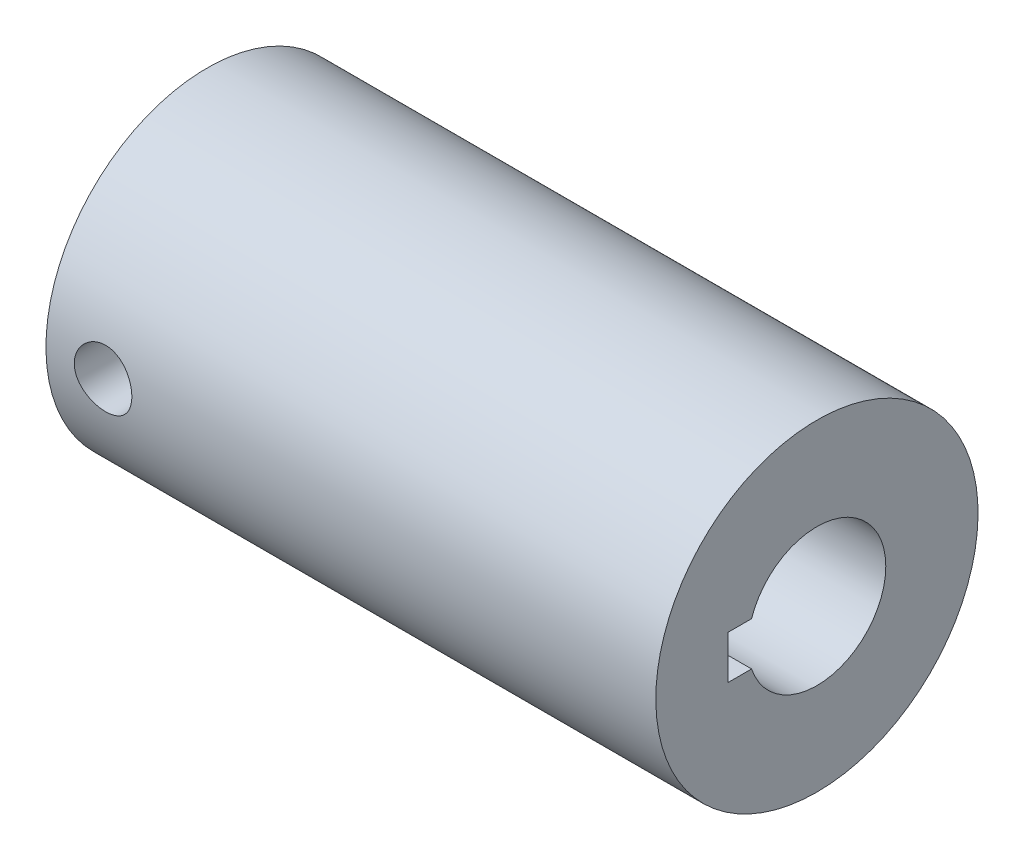
ISO-10303-21;
HEADER;
FILE_DESCRIPTION(('STEP AP214'),'2;1');
FILE_NAME('part.step','',(''),(''),'','','');
FILE_SCHEMA(('AUTOMOTIVE_DESIGN { 1 0 10303 214 1 1 1 1 }'));
ENDSEC;
DATA;
#1=APPLICATION_CONTEXT('core data for automotive mechanical design processes');
#2=APPLICATION_PROTOCOL_DEFINITION('international standard','automotive_design',2000,#1);
#3=PRODUCT_CONTEXT('',#1,'mechanical');
#4=PRODUCT('Part','Part','',(#3));
#5=PRODUCT_RELATED_PRODUCT_CATEGORY('part','',(#4));
#6=PRODUCT_DEFINITION_FORMATION('','',#4);
#7=PRODUCT_DEFINITION_CONTEXT('part definition',#1,'design');
#8=PRODUCT_DEFINITION('design','',#6,#7);
#9=PRODUCT_DEFINITION_SHAPE('','',#8);
#10=(LENGTH_UNIT() NAMED_UNIT(*) SI_UNIT(.MILLI.,.METRE.));
#11=(NAMED_UNIT(*) PLANE_ANGLE_UNIT() SI_UNIT($,.RADIAN.));
#12=(NAMED_UNIT(*) SI_UNIT($,.STERADIAN.) SOLID_ANGLE_UNIT());
#13=UNCERTAINTY_MEASURE_WITH_UNIT(LENGTH_MEASURE(1.E-05),#10,'distance_accuracy_value','');
#14=(GEOMETRIC_REPRESENTATION_CONTEXT(3) GLOBAL_UNCERTAINTY_ASSIGNED_CONTEXT((#13)) GLOBAL_UNIT_ASSIGNED_CONTEXT((#10,
#11,#12)) REPRESENTATION_CONTEXT('',''));
#15=CARTESIAN_POINT('',(0.,0.,0.));
#16=DIRECTION('',(0.,0.,1.));
#17=DIRECTION('',(1.,0.,0.));
#18=AXIS2_PLACEMENT_3D('',#15,#16,#17);
#19=CARTESIAN_POINT('',(30.1508,-2.99974000000001,0.));
#20=DIRECTION('',(0.,-1.,0.));
#21=DIRECTION('',(0.,0.,-1.));
#22=AXIS2_PLACEMENT_3D('',#19,#20,#21);
#23=PLANE('',#22);
#24=DIRECTION('',(0.,0.,1.));
#25=VECTOR('',#24,1.);
#26=CARTESIAN_POINT('',(-89.789,-2.99973999999995,0.));
#27=LINE('',#26,#25);
#28=CARTESIAN_POINT('',(-89.789,-2.99973999999995,9.01396471772544));
#29=VERTEX_POINT('',#28);
#30=CARTESIAN_POINT('',(-89.789,-2.99973999999995,12.2936));
#31=VERTEX_POINT('',#30);
#32=EDGE_CURVE('E89',#29,#31,#27,.T.);
#33=ORIENTED_EDGE('',*,*,#32,.T.);
#34=DIRECTION('',(1.,0.,0.));
#35=VECTOR('',#34,1.);
#36=CARTESIAN_POINT('',(30.1508,-2.99973999999994,12.2936));
#37=LINE('',#36,#35);
#38=CARTESIAN_POINT('',(-84.5135643141744,-2.99973999999993,12.2936));
#39=VERTEX_POINT('',#38);
#40=EDGE_CURVE('E84',#31,#39,#37,.T.);
#41=ORIENTED_EDGE('',*,*,#40,.T.);
#42=DIRECTION('',(0.,0.,-1.));
#43=VECTOR('',#42,1.);
#44=CARTESIAN_POINT('',(-84.5135643141744,-2.99973999999996,22.225));
#45=LINE('',#44,#43);
#46=CARTESIAN_POINT('',(-84.5135643141744,-2.99973999999992,9.01396471772545));
#47=VERTEX_POINT('',#46);
#48=EDGE_CURVE('E86',#39,#47,#45,.T.);
#49=ORIENTED_EDGE('',*,*,#48,.T.);
#50=DIRECTION('',(-1.,0.,0.));
#51=VECTOR('',#50,1.);
#52=CARTESIAN_POINT('',(-89.789,-2.99973999999996,9.01396471772544));
#53=LINE('',#52,#51);
#54=EDGE_CURVE('E208',#47,#29,#53,.T.);
#55=ORIENTED_EDGE('',*,*,#54,.T.);
#56=EDGE_LOOP('',(#33,#41,#49,#55));
#57=FACE_BOUND('',#56,.T.);
#58=ADVANCED_FACE('F17',(#57),#23,.F.);
#59=CARTESIAN_POINT('',(30.1508,-2.99973999999996,12.2936));
#60=DIRECTION('',(0.,0.,1.));
#61=DIRECTION('',(0.,-1.,0.));
#62=AXIS2_PLACEMENT_3D('',#59,#60,#61);
#63=PLANE('',#62);
#64=CARTESIAN_POINT('',(-81.915,0.,12.2936));
#65=DIRECTION('',(0.,0.,-1.));
#66=DIRECTION('',(0.,1.,0.));
#67=AXIS2_PLACEMENT_3D('',#64,#65,#66);
#68=CIRCLE('',#67,3.96875);
#69=CARTESIAN_POINT('',(-84.5135643141742,2.99974000000004,12.2936));
#70=VERTEX_POINT('',#69);
#71=EDGE_CURVE('E20',#70,#39,#68,.F.);
#72=ORIENTED_EDGE('',*,*,#71,.T.);
#73=ORIENTED_EDGE('',*,*,#40,.F.);
#74=DIRECTION('',(0.,1.,0.));
#75=VECTOR('',#74,1.);
#76=CARTESIAN_POINT('',(-89.789,0.,12.2936));
#77=LINE('',#76,#75);
#78=CARTESIAN_POINT('',(-89.789,2.99974000000005,12.2936));
#79=VERTEX_POINT('',#78);
#80=EDGE_CURVE('E122',#31,#79,#77,.T.);
#81=ORIENTED_EDGE('',*,*,#80,.T.);
#82=DIRECTION('',(1.,0.,0.));
#83=VECTOR('',#82,1.);
#84=CARTESIAN_POINT('',(30.1508,2.99974000000003,12.2936));
#85=LINE('',#84,#83);
#86=EDGE_CURVE('E78',#79,#70,#85,.T.);
#87=ORIENTED_EDGE('',*,*,#86,.T.);
#88=EDGE_LOOP('',(#72,#73,#81,#87));
#89=FACE_BOUND('',#88,.T.);
#90=ADVANCED_FACE('F94',(#89),#63,.F.);
#91=CARTESIAN_POINT('',(30.1508,2.99973999999998,0.));
#92=DIRECTION('',(0.,1.,0.));
#93=DIRECTION('',(0.,0.,1.));
#94=AXIS2_PLACEMENT_3D('',#91,#92,#93);
#95=PLANE('',#94);
#96=DIRECTION('',(0.,0.,-1.));
#97=VECTOR('',#96,1.);
#98=CARTESIAN_POINT('',(-84.5135643141742,2.99973999999998,22.225));
#99=LINE('',#98,#97);
#100=CARTESIAN_POINT('',(-84.5135643141742,2.99974000000004,9.01396471772541));
#101=VERTEX_POINT('',#100);
#102=EDGE_CURVE('E98',#101,#70,#99,.F.);
#103=ORIENTED_EDGE('',*,*,#102,.T.);
#104=ORIENTED_EDGE('',*,*,#86,.F.);
#105=DIRECTION('',(0.,0.,1.));
#106=VECTOR('',#105,1.);
#107=CARTESIAN_POINT('',(-89.789,2.99974000000005,0.));
#108=LINE('',#107,#106);
#109=CARTESIAN_POINT('',(-89.789,2.99974000000004,9.0139647177254));
#110=VERTEX_POINT('',#109);
#111=EDGE_CURVE('E125',#79,#110,#108,.F.);
#112=ORIENTED_EDGE('',*,*,#111,.T.);
#113=DIRECTION('',(-1.,0.,0.));
#114=VECTOR('',#113,1.);
#115=CARTESIAN_POINT('',(-89.789,2.99974000000004,9.0139647177254));
#116=LINE('',#115,#114);
#117=EDGE_CURVE('E132',#110,#101,#116,.F.);
#118=ORIENTED_EDGE('',*,*,#117,.T.);
#119=EDGE_LOOP('',(#103,#104,#112,#118));
#120=FACE_BOUND('',#119,.T.);
#121=ADVANCED_FACE('F176',(#120),#95,.F.);
#122=CARTESIAN_POINT('',(-81.915,0.,22.225));
#123=DIRECTION('',(0.,0.,-1.));
#124=DIRECTION('',(0.,1.,0.));
#125=AXIS2_PLACEMENT_3D('',#122,#123,#124);
#126=CYLINDRICAL_SURFACE('',#125,3.96875);
#127=CARTESIAN_POINT('',(-81.915,-3.96875000000008,21.867776485905));
#128=CARTESIAN_POINT('',(-82.025442636118,-3.96874939226582,21.8677767602575));
#129=CARTESIAN_POINT('',(-82.1359004163819,-3.96413569219448,21.8686154974175));
#130=CARTESIAN_POINT('',(-82.3560623582988,-3.94571332924585,21.8719467812869));
#131=CARTESIAN_POINT('',(-82.4657661490558,-3.9319004284361,21.8744400902305));
#132=CARTESIAN_POINT('',(-82.683775385004,-3.89514987144164,21.8810142396303));
#133=CARTESIAN_POINT('',(-82.7920783271779,-3.87219772983373,21.8850976000425));
#134=CARTESIAN_POINT('',(-83.0063423595681,-3.81735533042714,21.8947296463722));
#135=CARTESIAN_POINT('',(-83.1123025429119,-3.78546167456492,21.9002788893259));
#136=CARTESIAN_POINT('',(-83.4251730717987,-3.67680964916369,21.9188771458524));
#137=CARTESIAN_POINT('',(-83.6276048107322,-3.58698992518624,21.9338938717271));
#138=CARTESIAN_POINT('',(-84.0143457567725,-3.37526108072031,21.9674678496212));
#139=CARTESIAN_POINT('',(-84.1986613814016,-3.25336338033938,21.9860238409779));
#140=CARTESIAN_POINT('',(-84.5462627620137,-2.97940737605812,22.024827885717));
#141=CARTESIAN_POINT('',(-84.7093141951588,-2.82705339979221,22.0450913015638));
#142=CARTESIAN_POINT('',(-85.0076843051578,-2.49715122728141,22.0848910813289));
#143=CARTESIAN_POINT('',(-85.1429997936484,-2.31960013848836,22.1044273614489));
#144=CARTESIAN_POINT('',(-85.3829360222393,-1.94283484404581,22.140732248718));
#145=CARTESIAN_POINT('',(-85.4873397070742,-1.74348031319472,22.1574809389394));
#146=CARTESIAN_POINT('',(-85.6610876135916,-1.32971473489753,22.1861541422642));
#147=CARTESIAN_POINT('',(-85.7304347510135,-1.1153049413247,22.1980790565565));
#148=CARTESIAN_POINT('',(-85.8313885938242,-0.679916397485183,22.2156540237676));
#149=CARTESIAN_POINT('',(-85.8633861600919,-0.459030941855096,22.2213690185752));
#150=CARTESIAN_POINT('',(-85.8899490806145,-0.0149573644597973,22.2261037452233));
#151=CARTESIAN_POINT('',(-85.8845172772119,0.208230581171812,22.2251239854558));
#152=CARTESIAN_POINT('',(-85.836677977728,0.647894355631717,22.2166306580354));
#153=CARTESIAN_POINT('',(-85.7946915582586,0.864417646451671,22.2091914995076));
#154=CARTESIAN_POINT('',(-85.67559825955,1.28729742536011,22.1886983406287));
#155=CARTESIAN_POINT('',(-85.5984899110834,1.49365348773088,22.1756441053879));
#156=CARTESIAN_POINT('',(-85.4109324393134,1.8915794953395,22.1452617876054));
#157=CARTESIAN_POINT('',(-85.3003116588414,2.08306678025422,22.1279117869715));
#158=CARTESIAN_POINT('',(-85.0489950388308,2.44490698640731,22.0908619816255));
#159=CARTESIAN_POINT('',(-84.9082986963396,2.61525955413537,22.0711621376195));
#160=CARTESIAN_POINT('',(-84.5985607802396,2.93245913235298,22.0312791039267));
#161=CARTESIAN_POINT('',(-84.4291564141264,3.0789511418215,22.011092991898));
#162=CARTESIAN_POINT('',(-84.0677962242434,3.34159862141902,21.9727567806048));
#163=CARTESIAN_POINT('',(-83.8758303561112,3.45774050495988,21.9546075952613));
#164=CARTESIAN_POINT('',(-83.5750602440458,3.60663227272165,21.9304660897003));
#165=CARTESIAN_POINT('',(-83.4724860575241,3.6520968835151,21.9229227079668));
#166=CARTESIAN_POINT('',(-83.2637962407809,3.7342032369678,21.9090869485222));
#167=CARTESIAN_POINT('',(-83.1576820027668,3.77084840257221,21.9027940856336));
#168=CARTESIAN_POINT('',(-82.9428503304319,3.8349776001294,21.8916565995994));
#169=CARTESIAN_POINT('',(-82.834137561204,3.86247689561886,21.8868095649205));
#170=CARTESIAN_POINT('',(-82.6147600053551,3.90817796268864,21.8786953798662));
#171=CARTESIAN_POINT('',(-82.5040961821683,3.92638419713976,21.8754274711765));
#172=CARTESIAN_POINT('',(-82.313609781564,3.94948899290812,21.8712654442787));
#173=CARTESIAN_POINT('',(-82.2340696890173,3.95670884901232,21.8699589399116));
#174=CARTESIAN_POINT('',(-82.0746890365532,3.96633957521733,21.8682143610124));
#175=CARTESIAN_POINT('',(-81.9948484762651,3.96875043938326,21.867776287552));
#176=CARTESIAN_POINT('',(-81.804557363882,3.96874939226566,21.8677767602575));
#177=CARTESIAN_POINT('',(-81.6940995836181,3.96413569219431,21.8686154974175));
#178=CARTESIAN_POINT('',(-81.4739376417012,3.94571332924569,21.8719467812869));
#179=CARTESIAN_POINT('',(-81.3642338509442,3.93190042843594,21.8744400902305));
#180=CARTESIAN_POINT('',(-81.146224614996,3.89514987144147,21.8810142396303));
#181=CARTESIAN_POINT('',(-81.0379216728221,3.87219772983357,21.8850976000426));
#182=CARTESIAN_POINT('',(-80.8236576404319,3.81735533042697,21.8947296463723));
#183=CARTESIAN_POINT('',(-80.7176974570881,3.78546167456476,21.9002788893259));
#184=CARTESIAN_POINT('',(-80.4048269282013,3.67680964916353,21.9188771458524));
#185=CARTESIAN_POINT('',(-80.2023951892678,3.58698992518608,21.9338938717271));
#186=CARTESIAN_POINT('',(-79.8156542432275,3.37526108072015,21.9674678496212));
#187=CARTESIAN_POINT('',(-79.6313386185984,3.25336338033922,21.9860238409779));
#188=CARTESIAN_POINT('',(-79.2837372379863,2.97940737605796,22.0248278857171));
#189=CARTESIAN_POINT('',(-79.1206858048412,2.82705339979205,22.0450913015638));
#190=CARTESIAN_POINT('',(-78.8223156948422,2.49715122728125,22.0848910813289));
#191=CARTESIAN_POINT('',(-78.6870002063517,2.31960013848819,22.1044273614489));
#192=CARTESIAN_POINT('',(-78.4470639777607,1.94283484404565,22.1407322487181));
#193=CARTESIAN_POINT('',(-78.3426602929258,1.74348031319456,22.1574809389394));
#194=CARTESIAN_POINT('',(-78.1689123864084,1.32971473489736,22.1861541422642));
#195=CARTESIAN_POINT('',(-78.0995652489865,1.11530494132453,22.1980790565565));
#196=CARTESIAN_POINT('',(-77.9986114061758,0.679916397485019,22.2156540237676));
#197=CARTESIAN_POINT('',(-77.966613839908,0.459030941854932,22.2213690185752));
#198=CARTESIAN_POINT('',(-77.9400509193855,0.0149573644596333,22.2261037452233));
#199=CARTESIAN_POINT('',(-77.9454827227881,-0.208230581171976,22.2251239854558));
#200=CARTESIAN_POINT('',(-77.993322022272,-0.647894355631881,22.2166306580354));
#201=CARTESIAN_POINT('',(-78.0353084417414,-0.864417646451835,22.2091914995076));
#202=CARTESIAN_POINT('',(-78.15440174045,-1.28729742536028,22.1886983406287));
#203=CARTESIAN_POINT('',(-78.2315100889166,-1.49365348773105,22.1756441053879));
#204=CARTESIAN_POINT('',(-78.4190675606866,-1.89157949533966,22.1452617876054));
#205=CARTESIAN_POINT('',(-78.5296883411586,-2.08306678025438,22.1279117869714));
#206=CARTESIAN_POINT('',(-78.7810049611692,-2.44490698640748,22.0908619816255));
#207=CARTESIAN_POINT('',(-78.9217013036604,-2.61525955413553,22.0711621376195));
#208=CARTESIAN_POINT('',(-79.2314392197604,-2.93245913235314,22.0312791039267));
#209=CARTESIAN_POINT('',(-79.4008435858736,-3.07895114182165,22.011092991898));
#210=CARTESIAN_POINT('',(-79.7622037757566,-3.34159862141917,21.9727567806048));
#211=CARTESIAN_POINT('',(-79.9541696438888,-3.45774050496003,21.9546075952613));
#212=CARTESIAN_POINT('',(-80.2549397559542,-3.60663227272181,21.9304660897002));
#213=CARTESIAN_POINT('',(-80.3575139424759,-3.65209688351526,21.9229227079668));
#214=CARTESIAN_POINT('',(-80.5662037592191,-3.73420323696796,21.9090869485221));
#215=CARTESIAN_POINT('',(-80.6723179972332,-3.77084840257237,21.9027940856336));
#216=CARTESIAN_POINT('',(-80.8871496695681,-3.83497760012956,21.8916565995994));
#217=CARTESIAN_POINT('',(-80.995862438796,-3.86247689561902,21.8868095649205));
#218=CARTESIAN_POINT('',(-81.2152399946449,-3.9081779626888,21.8786953798662));
#219=CARTESIAN_POINT('',(-81.3259038178317,-3.92638419713992,21.8754274711765));
#220=CARTESIAN_POINT('',(-81.516390218436,-3.94948899290828,21.8712654442787));
#221=CARTESIAN_POINT('',(-81.5959303109827,-3.95670884901248,21.8699589399115));
#222=CARTESIAN_POINT('',(-81.7553109634468,-3.96633957521749,21.8682143610123));
#223=CARTESIAN_POINT('',(-81.8351515237349,-3.96875043938343,21.867776287552));
#224=CARTESIAN_POINT('',(-81.915,-3.96875000000008,21.867776485905));
#225=B_SPLINE_CURVE_WITH_KNOTS('',3,(#127,#128,#129,#130,#131,#132,#133,#134,#135,#136,#137,
#138,#139,#140,#141,#142,#143,#144,#145,#146,#147,#148,#149,#150,#151,#152,#153,#154,#155,#156,
#157,#158,#159,#160,#161,#162,#163,#164,#165,#166,#167,#168,#169,#170,#171,#172,#173,#174,#175,
#176,#177,#178,#179,#180,#181,#182,#183,#184,#185,#186,#187,#188,#189,#190,#191,#192,#193,#194,
#195,#196,#197,#198,#199,#200,#201,#202,#203,#204,#205,#206,#207,#208,#209,#210,#211,#212,#213,
#214,#215,#216,#217,#218,#219,#220,#221,#222,#223,#224),.UNSPECIFIED.,.T.,.F.,(4,2,2,2,2,2,2,2,
2,2,2,2,2,2,2,2,2,2,2,2,2,2,2,2,2,2,2,2,2,2,2,2,2,2,2,2,2,2,2,2,2,2,2,2,2,2,2,2,4),(0.,
0.3312540468426,0.662660803066436,0.994594933338746,1.326655380672,1.98917876452163,
2.65146660120484,3.32052692167795,3.98966411036536,4.66339407564918,5.33706799592654,
6.00362689698266,6.67013518089245,7.32906597023396,7.98802432662899,8.65041676272781,
9.31282027685519,9.98432225911643,10.6561243341013,10.993143739625,11.3300321316895,
11.666355436166,12.0025170734627,12.2420088058605,12.4815008338194,12.812754880662,
13.1441616368858,13.4760957671581,13.8081562144914,14.470679598341,15.1329674350242,
15.8020277554973,16.4711649441847,17.1448949094685,17.8185688297459,18.485127730802,
19.1516360147118,19.8105668040533,20.4695251604483,21.1319175965472,21.7943211106745,
22.4658230929358,23.1376251679207,23.4746445734444,23.8115329655088,24.1478562699853,
24.4840179072821,24.7235096396799,24.9630016676387),.UNSPECIFIED.);
#226=CARTESIAN_POINT('',(-81.915,-3.96875000000008,21.867776485905));
#227=VERTEX_POINT('',#226);
#228=EDGE_CURVE('E160',#227,#227,#225,.T.);
#229=ORIENTED_EDGE('',*,*,#228,.F.);
#230=EDGE_LOOP('',(#229));
#231=FACE_BOUND('',#230,.T.);
#232=DIRECTION('',(0.,0.,-1.));
#233=VECTOR('',#232,1.);
#234=CARTESIAN_POINT('',(-79.3164356858256,-2.99973999999999,0.));
#235=LINE('',#234,#233);
#236=CARTESIAN_POINT('',(-79.3164356858256,-2.99973999999995,12.2936));
#237=VERTEX_POINT('',#236);
#238=CARTESIAN_POINT('',(-79.3164356858257,-2.99973999999999,9.01396471772542));
#239=VERTEX_POINT('',#238);
#240=EDGE_CURVE('E130',#237,#239,#235,.T.);
#241=ORIENTED_EDGE('',*,*,#240,.T.);
#242=CARTESIAN_POINT('',(-79.3164356858256,-2.99973999999991,9.01396471772545));
#243=CARTESIAN_POINT('',(-79.3983222792562,-3.07068039369602,8.99035707887533));
#244=CARTESIAN_POINT('',(-79.4831535142427,-3.13829205323615,8.96692573026261));
#245=CARTESIAN_POINT('',(-79.6582677904997,-3.26648242088814,8.92102730921554));
#246=CARTESIAN_POINT('',(-79.7485528502424,-3.3270585005732,8.89856059912426));
#247=CARTESIAN_POINT('',(-79.9345855776714,-3.44106130640778,8.85510252743834));
#248=CARTESIAN_POINT('',(-80.0303605479398,-3.49444689728862,8.83411995577877));
#249=CARTESIAN_POINT('',(-80.2263688719001,-3.59326384817144,8.79438980513345));
#250=CARTESIAN_POINT('',(-80.3266018370967,-3.6386958995943,8.77564203191639));
#251=CARTESIAN_POINT('',(-80.5312558990761,-3.72135007423965,8.74091365969216));
#252=CARTESIAN_POINT('',(-80.635689532916,-3.75854507297452,8.72494223923401));
#253=CARTESIAN_POINT('',(-80.8476782669221,-3.82414729671764,8.69638883584724));
#254=CARTESIAN_POINT('',(-80.9552316505884,-3.85255925750912,8.68380502680487));
#255=CARTESIAN_POINT('',(-81.1722679971477,-3.9002079248989,8.66250873194914));
#256=CARTESIAN_POINT('',(-81.2817414363647,-3.91948114860075,8.65378084812111));
#257=CARTESIAN_POINT('',(-81.5021123178601,-3.94877687341527,8.64045274865463));
#258=CARTESIAN_POINT('',(-81.6130086186215,-3.95880637099622,8.6358494112688));
#259=CARTESIAN_POINT('',(-81.7559125649114,-3.96568809644164,8.63268894350365));
#260=CARTESIAN_POINT('',(-81.7877126497391,-3.96683590332926,8.6321615814543));
#261=CARTESIAN_POINT('',(-81.8513406139823,-3.96836703005052,8.63145780763449));
#262=CARTESIAN_POINT('',(-81.8831684972045,-3.96875021986356,8.63128145555215));
#263=CARTESIAN_POINT('',(-82.0208417937746,-3.96874926893967,8.63128242580113));
#264=CARTESIAN_POINT('',(-82.1267236057425,-3.96450954031114,8.63323540984761));
#265=CARTESIAN_POINT('',(-82.3377161694843,-3.9475946321834,8.64098259166782));
#266=CARTESIAN_POINT('',(-82.4428263560302,-3.93491379279579,8.64677936674967));
#267=CARTESIAN_POINT('',(-82.6516986829563,-3.901212974202,8.6620368059383));
#268=CARTESIAN_POINT('',(-82.7554570025672,-3.88017314342153,8.67150619075743));
#269=CARTESIAN_POINT('',(-82.9606409715404,-3.829985136176,8.69378848855924));
#270=CARTESIAN_POINT('',(-83.0620656469935,-3.80083363858277,8.70660277089693));
#271=CARTESIAN_POINT('',(-83.3610198220862,-3.70187466908696,8.74936196851514));
#272=CARTESIAN_POINT('',(-83.5541927153672,-3.62040450277096,8.78369952559839));
#273=CARTESIAN_POINT('',(-83.9237276406492,-3.42917585897011,8.86009306725311));
#274=CARTESIAN_POINT('',(-84.100118584184,-3.31946728451142,8.90213539854763));
#275=CARTESIAN_POINT('',(-84.3515670397813,-3.13453068697954,8.96822929568858));
#276=CARTESIAN_POINT('',(-84.4339790218913,-3.06869452501721,8.99101903443125));
#277=CARTESIAN_POINT('',(-84.5135643141744,-2.99973999999993,9.01396471772544));
#278=B_SPLINE_CURVE_WITH_KNOTS('',3,(#242,#243,#244,#245,#246,#247,#248,#249,#250,#251,#252,
#253,#254,#255,#256,#257,#258,#259,#260,#261,#262,#263,#264,#265,#266,#267,#268,#269,#270,#271,
#272,#273,#274,#275,#276,#277),.UNSPECIFIED.,.F.,.F.,(4,2,2,2,2,2,2,2,2,2,2,2,2,2,2,2,2,4),(0.,
0.332575233822847,0.665274317684792,0.99980245463394,1.33430149576714,1.66988617782768,
2.00528959691642,2.33934125531071,2.67313986577004,2.76860807450406,2.86409251590905,
3.181584423872,3.49928942953468,3.81775349934234,4.13634814899188,4.77063742091392,
5.40381337953625,5.72719917027488),.UNSPECIFIED.);
#279=EDGE_CURVE('E101',#239,#47,#278,.T.);
#280=ORIENTED_EDGE('',*,*,#279,.T.);
#281=ORIENTED_EDGE('',*,*,#48,.F.);
#282=ORIENTED_EDGE('',*,*,#71,.F.);
#283=ORIENTED_EDGE('',*,*,#102,.F.);
#284=CARTESIAN_POINT('',(-84.5135643141742,2.99974000000003,9.01396471772541));
#285=CARTESIAN_POINT('',(-84.4316777207436,3.07068039369614,8.9903570788753));
#286=CARTESIAN_POINT('',(-84.3468464857571,3.13829205323627,8.96692573026257));
#287=CARTESIAN_POINT('',(-84.1717322095001,3.26648242088824,8.92102730921551));
#288=CARTESIAN_POINT('',(-84.0814471497573,3.3270585005733,8.89856059912423));
#289=CARTESIAN_POINT('',(-83.8954144223283,3.44106130640786,8.85510252743831));
#290=CARTESIAN_POINT('',(-83.79963945206,3.4944468972887,8.83411995577874));
#291=CARTESIAN_POINT('',(-83.6036311280996,3.5932638481715,8.79438980513343));
#292=CARTESIAN_POINT('',(-83.503398162903,3.63869589959435,8.77564203191637));
#293=CARTESIAN_POINT('',(-83.2987441009236,3.72135007423969,8.74091365969215));
#294=CARTESIAN_POINT('',(-83.1943104670837,3.75854507297456,8.724942239234));
#295=CARTESIAN_POINT('',(-82.9823217330776,3.82414729671766,8.69638883584723));
#296=CARTESIAN_POINT('',(-82.8747683494113,3.85255925750912,8.68380502680487));
#297=CARTESIAN_POINT('',(-82.657732002852,3.90020792489889,8.66250873194915));
#298=CARTESIAN_POINT('',(-82.548258563635,3.91948114860073,8.65378084812112));
#299=CARTESIAN_POINT('',(-82.3278876821397,3.94877687341524,8.64045274865465));
#300=CARTESIAN_POINT('',(-82.2169913813782,3.95880637099618,8.63584941126882));
#301=CARTESIAN_POINT('',(-82.0740874350884,3.96568809644158,8.63268894350368));
#302=CARTESIAN_POINT('',(-82.0422873502608,3.9668359033292,8.63216158145433));
#303=CARTESIAN_POINT('',(-81.9786593860176,3.96836703005046,8.63145780763453));
#304=CARTESIAN_POINT('',(-81.9468315027955,3.96875021986349,8.63128145555219));
#305=CARTESIAN_POINT('',(-81.8091582062254,3.96874926893961,8.63128242580116));
#306=CARTESIAN_POINT('',(-81.7032763942576,3.96450954031107,8.63323540984764));
#307=CARTESIAN_POINT('',(-81.4922838305158,3.94759463218334,8.64098259166785));
#308=CARTESIAN_POINT('',(-81.3871736439699,3.93491379279573,8.6467793667497));
#309=CARTESIAN_POINT('',(-81.1783013170437,3.90121297420194,8.66203680593833));
#310=CARTESIAN_POINT('',(-81.0745429974328,3.88017314342147,8.67150619075746));
#311=CARTESIAN_POINT('',(-80.8693590284596,3.82998513617593,8.69378848855927));
#312=CARTESIAN_POINT('',(-80.7679343530065,3.80083363858271,8.70660277089696));
#313=CARTESIAN_POINT('',(-80.4689801779138,3.7018746690869,8.74936196851517));
#314=CARTESIAN_POINT('',(-80.2758072846328,3.6204045027709,8.78369952559842));
#315=CARTESIAN_POINT('',(-79.9062723593508,3.42917585897004,8.86009306725314));
#316=CARTESIAN_POINT('',(-79.729881415816,3.31946728451136,8.90213539854766));
#317=CARTESIAN_POINT('',(-79.4784329602187,3.13453068697952,8.96822929568859));
#318=CARTESIAN_POINT('',(-79.3960209781088,3.06869452501725,8.99101903443124));
#319=CARTESIAN_POINT('',(-79.3164356858258,2.99974000000004,9.01396471772541));
#320=B_SPLINE_CURVE_WITH_KNOTS('',3,(#284,#285,#286,#287,#288,#289,#290,#291,#292,#293,#294,
#295,#296,#297,#298,#299,#300,#301,#302,#303,#304,#305,#306,#307,#308,#309,#310,#311,#312,#313,
#314,#315,#316,#317,#318,#319),.UNSPECIFIED.,.F.,.F.,(4,2,2,2,2,2,2,2,2,2,2,2,2,2,2,2,2,4),(0.,
0.332575233822846,0.665274317684791,0.999802454633955,1.33430149576713,1.66988617782767,
2.00528959691641,2.33934125531069,2.67313986577001,2.76860807450388,2.86409251590875,
3.18158442387167,3.49928942953435,3.81775349934204,4.13634814899158,4.77063742091363,
5.40381337953595,5.72719917027432),.UNSPECIFIED.);
#321=CARTESIAN_POINT('',(-79.3164356858258,2.99974000000004,9.01396471772541));
#322=VERTEX_POINT('',#321);
#323=EDGE_CURVE('E187',#101,#322,#320,.T.);
#324=ORIENTED_EDGE('',*,*,#323,.T.);
#325=DIRECTION('',(0.,0.,1.));
#326=VECTOR('',#325,1.);
#327=CARTESIAN_POINT('',(-79.3164356858258,2.99974,0.));
#328=LINE('',#327,#326);
#329=CARTESIAN_POINT('',(-79.3164356858258,2.99974000000004,12.2936));
#330=VERTEX_POINT('',#329);
#331=EDGE_CURVE('E104',#322,#330,#328,.T.);
#332=ORIENTED_EDGE('',*,*,#331,.T.);
#333=CARTESIAN_POINT('',(-81.915,0.,12.2936));
#334=DIRECTION('',(0.,0.,-1.));
#335=DIRECTION('',(0.,1.,0.));
#336=AXIS2_PLACEMENT_3D('',#333,#334,#335);
#337=CIRCLE('',#336,3.96875);
#338=EDGE_CURVE('E193',#330,#237,#337,.T.);
#339=ORIENTED_EDGE('',*,*,#338,.T.);
#340=EDGE_LOOP('',(#241,#280,#281,#282,#283,#324,#332,#339));
#341=FACE_BOUND('',#340,.T.);
#342=ADVANCED_FACE('F100',(#231,#341),#126,.F.);
#343=CARTESIAN_POINT('',(30.1508,2.99973999999998,0.));
#344=DIRECTION('',(0.,1.,0.));
#345=DIRECTION('',(0.,0.,1.));
#346=AXIS2_PLACEMENT_3D('',#343,#344,#345);
#347=PLANE('',#346);
#348=DIRECTION('',(0.,0.,1.));
#349=VECTOR('',#348,1.);
#350=CARTESIAN_POINT('',(-5.6642,2.99974000000012,0.));
#351=LINE('',#350,#349);
#352=CARTESIAN_POINT('',(-5.6642,2.99974000000014,9.01396471772541));
#353=VERTEX_POINT('',#352);
#354=CARTESIAN_POINT('',(-5.6642,2.99974000000009,12.2936));
#355=VERTEX_POINT('',#354);
#356=EDGE_CURVE('E168',#353,#355,#351,.T.);
#357=ORIENTED_EDGE('',*,*,#356,.T.);
#358=DIRECTION('',(1.,0.,0.));
#359=VECTOR('',#358,1.);
#360=CARTESIAN_POINT('',(30.1508,2.99974000000004,12.2936));
#361=LINE('',#360,#359);
#362=EDGE_CURVE('E110',#355,#330,#361,.F.);
#363=ORIENTED_EDGE('',*,*,#362,.T.);
#364=ORIENTED_EDGE('',*,*,#331,.F.);
#365=DIRECTION('',(-1.,0.,0.));
#366=VECTOR('',#365,1.);
#367=CARTESIAN_POINT('',(-89.789,2.99974000000003,9.01396471772541));
#368=LINE('',#367,#366);
#369=EDGE_CURVE('E192',#322,#353,#368,.F.);
#370=ORIENTED_EDGE('',*,*,#369,.T.);
#371=EDGE_LOOP('',(#357,#363,#364,#370));
#372=FACE_BOUND('',#371,.T.);
#373=ADVANCED_FACE('F175',(#372),#347,.F.);
#374=CARTESIAN_POINT('',(30.1508,-2.99973999999996,12.2936));
#375=DIRECTION('',(0.,0.,1.));
#376=DIRECTION('',(0.,-1.,0.));
#377=AXIS2_PLACEMENT_3D('',#374,#375,#376);
#378=PLANE('',#377);
#379=ORIENTED_EDGE('',*,*,#338,.F.);
#380=ORIENTED_EDGE('',*,*,#362,.F.);
#381=DIRECTION('',(0.,-1.,0.));
#382=VECTOR('',#381,1.);
#383=CARTESIAN_POINT('',(-5.6642,0.,12.2936));
#384=LINE('',#383,#382);
#385=CARTESIAN_POINT('',(-5.6642,-2.99973999999996,12.2936));
#386=VERTEX_POINT('',#385);
#387=EDGE_CURVE('E232',#355,#386,#384,.T.);
#388=ORIENTED_EDGE('',*,*,#387,.T.);
#389=DIRECTION('',(1.,0.,0.));
#390=VECTOR('',#389,1.);
#391=CARTESIAN_POINT('',(30.1508,-2.99973999999997,12.2936));
#392=LINE('',#391,#390);
#393=EDGE_CURVE('E133',#386,#237,#392,.F.);
#394=ORIENTED_EDGE('',*,*,#393,.T.);
#395=EDGE_LOOP('',(#379,#380,#388,#394));
#396=FACE_BOUND('',#395,.T.);
#397=ADVANCED_FACE('F247',(#396),#378,.F.);
#398=CARTESIAN_POINT('',(30.1508,-2.99974000000001,0.));
#399=DIRECTION('',(0.,-1.,0.));
#400=DIRECTION('',(0.,0.,-1.));
#401=AXIS2_PLACEMENT_3D('',#398,#399,#400);
#402=PLANE('',#401);
#403=ORIENTED_EDGE('',*,*,#240,.F.);
#404=ORIENTED_EDGE('',*,*,#393,.F.);
#405=DIRECTION('',(0.,0.,1.));
#406=VECTOR('',#405,1.);
#407=CARTESIAN_POINT('',(-5.6642,-2.99973999999996,0.));
#408=LINE('',#407,#406);
#409=CARTESIAN_POINT('',(-5.66419999999999,-2.99973999999993,9.0139647177254));
#410=VERTEX_POINT('',#409);
#411=EDGE_CURVE('E36',#386,#410,#408,.F.);
#412=ORIENTED_EDGE('',*,*,#411,.T.);
#413=DIRECTION('',(-1.,0.,0.));
#414=VECTOR('',#413,1.);
#415=CARTESIAN_POINT('',(-89.789,-2.99974000000004,9.01396471772541));
#416=LINE('',#415,#414);
#417=EDGE_CURVE('E218',#410,#239,#416,.T.);
#418=ORIENTED_EDGE('',*,*,#417,.T.);
#419=EDGE_LOOP('',(#403,#404,#412,#418));
#420=FACE_BOUND('',#419,.T.);
#421=ADVANCED_FACE('F198',(#420),#402,.F.);
#422=CARTESIAN_POINT('',(-89.789,0.,0.));
#423=DIRECTION('',(-1.,0.,0.));
#424=DIRECTION('',(0.,-1.,0.));
#425=AXIS2_PLACEMENT_3D('',#422,#423,#424);
#426=CYLINDRICAL_SURFACE('',#425,9.49999999999993);
#427=CARTESIAN_POINT('',(-81.915,-8.63128167988391,3.96874999999988));
#428=CARTESIAN_POINT('',(-82.021023597883,-8.6312779894145,3.96875347623766));
#429=CARTESIAN_POINT('',(-82.1270139445376,-8.63323939334138,3.96449945655337));
#430=CARTESIAN_POINT('',(-82.3382063568204,-8.64100729327738,3.94754208884714));
#431=CARTESIAN_POINT('',(-82.4434082878847,-8.64681443119831,3.93483733026611));
#432=CARTESIAN_POINT('',(-82.6522544794019,-8.66208489793906,3.90110575348234));
#433=CARTESIAN_POINT('',(-82.755897902253,-8.67155012458276,3.88007461539853));
#434=CARTESIAN_POINT('',(-82.9608566278819,-8.69381587761883,3.82992302444619));
#435=CARTESIAN_POINT('',(-83.0621709911155,-8.7066177251774,3.80079936696639));
#436=CARTESIAN_POINT('',(-83.3608289432014,-8.74933489226523,3.70193666042117));
#437=CARTESIAN_POINT('',(-83.5538295481628,-8.78363649894846,3.62055102432765));
#438=CARTESIAN_POINT('',(-83.9233687222483,-8.86000680154524,3.4294029516037));
#439=CARTESIAN_POINT('',(-84.0999041275458,-8.90207698560021,3.31963507648292));
#440=CARTESIAN_POINT('',(-84.4426286714025,-8.99216724622874,3.06754558124399));
#441=CARTESIAN_POINT('',(-84.6076701463806,-9.04038917558129,2.92373537748897));
#442=CARTESIAN_POINT('',(-84.9122046985092,-9.13571517816781,2.61063274035951));
#443=CARTESIAN_POINT('',(-85.0516866748964,-9.18281875799665,2.44132929287457));
#444=CARTESIAN_POINT('',(-85.2417129239102,-9.24999130231497,2.16727689601721));
#445=CARTESIAN_POINT('',(-85.3029276138123,-9.27223158531244,2.07029351014673));
#446=CARTESIAN_POINT('',(-85.4169070389088,-9.31448182225805,1.87103681360442));
#447=CARTESIAN_POINT('',(-85.4696751479261,-9.33449266573678,1.76876563674254));
#448=CARTESIAN_POINT('',(-85.5662472833894,-9.37169379322909,1.55968568065201));
#449=CARTESIAN_POINT('',(-85.6100587719195,-9.38888642281196,1.45288076898336));
#450=CARTESIAN_POINT('',(-85.6883198939371,-9.41996185783605,1.23546934791932));
#451=CARTESIAN_POINT('',(-85.7227719366253,-9.43384551492174,1.1248638251069));
#452=CARTESIAN_POINT('',(-85.7957489070759,-9.46348941078883,0.848320970515816));
#453=CARTESIAN_POINT('',(-85.8286799618956,-9.47710512538475,0.680635337615508));
#454=CARTESIAN_POINT('',(-85.8726763217587,-9.495357642977,0.341938136446294));
#455=CARTESIAN_POINT('',(-85.8837448724536,-9.49999577875974,0.170927065670677));
#456=CARTESIAN_POINT('',(-85.8837531942116,-9.50000262962695,-0.106479235948));
#457=CARTESIAN_POINT('',(-85.879463024511,-9.49820698387372,-0.212925872176984));
#458=CARTESIAN_POINT('',(-85.8623572574927,-9.49107930926574,-0.425044403727716));
#459=CARTESIAN_POINT('',(-85.8495402645977,-9.48574670152007,-0.53071616936427));
#460=CARTESIAN_POINT('',(-85.8155016363395,-9.47167863399474,-0.740513417679456));
#461=CARTESIAN_POINT('',(-85.7942764129208,-9.46294172151763,-0.844638220514291));
#462=CARTESIAN_POINT('',(-85.7436469543012,-9.44230031321358,-1.05057248786455));
#463=CARTESIAN_POINT('',(-85.7142395601274,-9.43039459405078,-1.15238104166684));
#464=CARTESIAN_POINT('',(-85.6143354433725,-9.39043778633247,-1.45265415164847));
#465=CARTESIAN_POINT('',(-85.5320251938872,-9.35809008921782,-1.64676450388717));
#466=CARTESIAN_POINT('',(-85.338700721248,-9.28508333086904,-2.01821637811483));
#467=CARTESIAN_POINT('',(-85.2276828219552,-9.24442320533214,-2.1955557485319));
#468=CARTESIAN_POINT('',(-84.9741864537021,-9.15657636963178,-2.53765409395779));
#469=CARTESIAN_POINT('',(-84.8304995195851,-9.10917597342642,-2.70146428786763));
#470=CARTESIAN_POINT('',(-84.5183405423545,-9.014115377615,-3.00347311006065));
#471=CARTESIAN_POINT('',(-84.3498542950117,-8.96645504429124,-3.14165695722136));
#472=CARTESIAN_POINT('',(-83.9825183073476,-8.87359524321422,-3.39536480674629));
#473=CARTESIAN_POINT('',(-83.7825724884597,-8.82863749933993,-3.50941273121675));
#474=CARTESIAN_POINT('',(-83.4691298152337,-8.76947922613183,-3.65361786060223));
#475=CARTESIAN_POINT('',(-83.3624049373519,-8.75114077733548,-3.69720578554283));
#476=CARTESIAN_POINT('',(-83.1451091882112,-8.7178367439429,-3.77506457659102));
#477=CARTESIAN_POINT('',(-83.0345393821875,-8.70287023361279,-3.80933800044123));
#478=CARTESIAN_POINT('',(-82.7589213179174,-8.67092335642019,-3.88166580053821));
#479=CARTESIAN_POINT('',(-82.5921400519251,-8.65616621166979,-3.91424804173395));
#480=CARTESIAN_POINT('',(-82.2552101873042,-8.63634937305926,-3.95778503431226));
#481=CARTESIAN_POINT('',(-82.0850623187706,-8.631287599413,-3.96874442409938));
#482=CARTESIAN_POINT('',(-81.808976402117,-8.63127798941439,-3.96875347623791));
#483=CARTESIAN_POINT('',(-81.7029860554624,-8.63323939334126,-3.96449945655362));
#484=CARTESIAN_POINT('',(-81.4917936431797,-8.64100729327726,-3.94754208884739));
#485=CARTESIAN_POINT('',(-81.3865917121153,-8.64681443119819,-3.93483733026636));
#486=CARTESIAN_POINT('',(-81.1777455205981,-8.66208489793894,-3.90110575348259));
#487=CARTESIAN_POINT('',(-81.074102097747,-8.67155012458264,-3.88007461539878));
#488=CARTESIAN_POINT('',(-80.8691433721181,-8.69381587761871,-3.82992302444645));
#489=CARTESIAN_POINT('',(-80.7678290088845,-8.70661772517728,-3.80079936696665));
#490=CARTESIAN_POINT('',(-80.4691710567986,-8.74933489226512,-3.70193666042142));
#491=CARTESIAN_POINT('',(-80.2761704518372,-8.78363649894835,-3.6205510243279));
#492=CARTESIAN_POINT('',(-79.9066312777517,-8.86000680154514,-3.42940295160395));
#493=CARTESIAN_POINT('',(-79.7300958724542,-8.90207698560011,-3.31963507648317));
#494=CARTESIAN_POINT('',(-79.3873713285975,-8.99216724622864,-3.06754558124425));
#495=CARTESIAN_POINT('',(-79.2223298536194,-9.0403891755812,-2.92373537748923));
#496=CARTESIAN_POINT('',(-78.9177953014908,-9.13571517816773,-2.61063274035977));
#497=CARTESIAN_POINT('',(-78.7783133251036,-9.18281875799656,-2.44132929287483));
#498=CARTESIAN_POINT('',(-78.5882870760898,-9.24999130231489,-2.16727689601748));
#499=CARTESIAN_POINT('',(-78.5270723861877,-9.27223158531236,-2.070293510147));
#500=CARTESIAN_POINT('',(-78.4130929610912,-9.31448182225798,-1.87103681360469));
#501=CARTESIAN_POINT('',(-78.3603248520739,-9.33449266573671,-1.76876563674282));
#502=CARTESIAN_POINT('',(-78.2637527166106,-9.37169379322903,-1.55968568065229));
#503=CARTESIAN_POINT('',(-78.2199412280805,-9.38888642281191,-1.45288076898364));
#504=CARTESIAN_POINT('',(-78.1416801060629,-9.419961857836,-1.2354693479196));
#505=CARTESIAN_POINT('',(-78.1072280633746,-9.4338455149217,-1.12486382510717));
#506=CARTESIAN_POINT('',(-78.0342510929241,-9.4634894107888,-0.84832097051605));
#507=CARTESIAN_POINT('',(-78.0013200381044,-9.47710512538472,-0.680635337615702));
#508=CARTESIAN_POINT('',(-77.9573236782413,-9.49535764297698,-0.341938136446406));
#509=CARTESIAN_POINT('',(-77.9462551275463,-9.49999577875972,-0.170927065670748));
#510=CARTESIAN_POINT('',(-77.9462468057884,-9.50000262962694,0.106479235947969));
#511=CARTESIAN_POINT('',(-77.950536975489,-9.49820698387371,0.212925872176953));
#512=CARTESIAN_POINT('',(-77.9676427425074,-9.49107930926573,0.425044403727683));
#513=CARTESIAN_POINT('',(-77.9804597354024,-9.48574670152006,0.530716169364235));
#514=CARTESIAN_POINT('',(-78.0144983636606,-9.47167863399473,0.740513417679423));
#515=CARTESIAN_POINT('',(-78.0357235870793,-9.46294172151762,0.844638220514259));
#516=CARTESIAN_POINT('',(-78.0863530456989,-9.44230031321357,1.05057248786452));
#517=CARTESIAN_POINT('',(-78.1157604398727,-9.43039459405078,1.15238104166681));
#518=CARTESIAN_POINT('',(-78.2156645566275,-9.39043778633246,1.45265415164844));
#519=CARTESIAN_POINT('',(-78.2979748061129,-9.35809008921782,1.64676450388712));
#520=CARTESIAN_POINT('',(-78.4912992787521,-9.28508333086904,2.01821637811478));
#521=CARTESIAN_POINT('',(-78.602317178045,-9.24442320533214,2.19555574853185));
#522=CARTESIAN_POINT('',(-78.855813546298,-9.15657636963178,2.53765409395773));
#523=CARTESIAN_POINT('',(-78.9995004804151,-9.10917597342644,2.70146428786756));
#524=CARTESIAN_POINT('',(-79.3116594576457,-9.01411537761502,3.00347311006056));
#525=CARTESIAN_POINT('',(-79.4801457049886,-8.96645504429127,3.14165695722126));
#526=CARTESIAN_POINT('',(-79.8474816926527,-8.87359524321426,3.39536480674617));
#527=CARTESIAN_POINT('',(-80.0474275115405,-8.82863749933998,3.50941273121662));
#528=CARTESIAN_POINT('',(-80.3608701847665,-8.76947922613189,3.65361786060208));
#529=CARTESIAN_POINT('',(-80.4675950626484,-8.75114077733554,3.69720578554267));
#530=CARTESIAN_POINT('',(-80.684890811789,-8.71783674394296,3.77506457659085));
#531=CARTESIAN_POINT('',(-80.7954606178128,-8.70287023361286,3.80933800044106));
#532=CARTESIAN_POINT('',(-81.0710786820828,-8.67092335642028,3.88166580053801));
#533=CARTESIAN_POINT('',(-81.2378599480751,-8.65616621166989,3.91424804173374));
#534=CARTESIAN_POINT('',(-81.5747898126959,-8.63634937305937,3.95778503431202));
#535=CARTESIAN_POINT('',(-81.7449376812294,-8.63128759941311,3.96874442409913));
#536=CARTESIAN_POINT('',(-81.915,-8.63128167988391,3.96874999999988));
#537=B_SPLINE_CURVE_WITH_KNOTS('',3,(#427,#428,#429,#430,#431,#432,#433,#434,#435,#436,#437,
#438,#439,#440,#441,#442,#443,#444,#445,#446,#447,#448,#449,#450,#451,#452,#453,#454,#455,#456,
#457,#458,#459,#460,#461,#462,#463,#464,#465,#466,#467,#468,#469,#470,#471,#472,#473,#474,#475,
#476,#477,#478,#479,#480,#481,#482,#483,#484,#485,#486,#487,#488,#489,#490,#491,#492,#493,#494,
#495,#496,#497,#498,#499,#500,#501,#502,#503,#504,#505,#506,#507,#508,#509,#510,#511,#512,#513,
#514,#515,#516,#517,#518,#519,#520,#521,#522,#523,#524,#525,#526,#527,#528,#529,#530,#531,#532,
#533,#534,#535,#536),.UNSPECIFIED.,.T.,.F.,(4,2,2,2,2,2,2,2,2,2,2,2,2,2,2,2,2,2,2,2,2,2,2,2,2,2,
2,2,2,2,2,2,2,2,2,2,2,2,2,2,2,2,2,2,2,2,2,2,2,2,2,2,2,2,4),(0.,0.317909964181839,
0.63587300577648,0.954001229166031,1.27225561027031,1.90592752535276,2.53972095219447,
3.20931438372648,3.87919794113044,4.22929424273013,4.57925035431319,4.92891370581882,
5.27848696554417,5.79109059944549,6.30361812779696,6.62289781242178,6.94222976612145,
7.26169813582441,7.58129001745103,8.21807118549155,8.85493393653786,9.52097836323733,
10.1874057735492,10.8871111733,11.2369022082714,11.5865970940779,12.0966355014996,
12.6065644866366,12.9244744508184,13.2424374924131,13.5605657158026,13.8788200969069,
14.5124920119894,15.1462854388311,15.8158788703631,16.485762427767,16.8358587293667,
17.1858148409498,17.5354781924554,17.8850514521808,18.3976550860822,18.9101826144338,
19.2294622990586,19.5487942527583,19.8682626224613,20.1878545040879,20.8246356721284,
21.4614984231747,22.1275428498742,22.7939702601861,23.4936756599368,23.8434666949083,
24.1931615807149,24.7031999881364,25.2131289732732),.UNSPECIFIED.);
#538=CARTESIAN_POINT('',(-81.915,-8.63128167988391,3.96874999999988));
#539=VERTEX_POINT('',#538);
#540=EDGE_CURVE('E202',#539,#539,#537,.T.);
#541=ORIENTED_EDGE('',*,*,#540,.T.);
#542=EDGE_LOOP('',(#541));
#543=FACE_BOUND('',#542,.T.);
#544=ORIENTED_EDGE('',*,*,#54,.F.);
#545=ORIENTED_EDGE('',*,*,#279,.F.);
#546=ORIENTED_EDGE('',*,*,#417,.F.);
#547=CARTESIAN_POINT('',(-5.66419999999999,1.31899960685068E-13,0.));
#548=DIRECTION('',(-1.,0.,0.));
#549=DIRECTION('',(0.,-1.,0.));
#550=AXIS2_PLACEMENT_3D('',#547,#548,#549);
#551=CIRCLE('',#550,9.49999999999993);
#552=EDGE_CURVE('E147',#410,#353,#551,.F.);
#553=ORIENTED_EDGE('',*,*,#552,.T.);
#554=ORIENTED_EDGE('',*,*,#369,.F.);
#555=ORIENTED_EDGE('',*,*,#323,.F.);
#556=ORIENTED_EDGE('',*,*,#117,.F.);
#557=CARTESIAN_POINT('',(-89.789,0.,0.));
#558=DIRECTION('',(-1.,0.,0.));
#559=DIRECTION('',(0.,-1.,0.));
#560=AXIS2_PLACEMENT_3D('',#557,#558,#559);
#561=CIRCLE('',#560,9.49999999999993);
#562=EDGE_CURVE('E169',#110,#29,#561,.T.);
#563=ORIENTED_EDGE('',*,*,#562,.T.);
#564=EDGE_LOOP('',(#544,#545,#546,#553,#554,#555,#556,#563));
#565=FACE_BOUND('',#564,.T.);
#566=ADVANCED_FACE('F194',(#543,#565),#426,.F.);
#567=CARTESIAN_POINT('',(-81.915,0.,0.));
#568=DIRECTION('',(0.,1.,0.));
#569=DIRECTION('',(0.,0.,1.));
#570=AXIS2_PLACEMENT_3D('',#567,#568,#569);
#571=CYLINDRICAL_SURFACE('',#570,3.96875);
#572=ORIENTED_EDGE('',*,*,#540,.F.);
#573=EDGE_LOOP('',(#572));
#574=FACE_BOUND('',#573,.T.);
#575=CARTESIAN_POINT('',(-77.94625,-22.225,0.));
#576=CARTESIAN_POINT('',(-77.9462595756592,-22.2249956688186,-0.221012456149583));
#577=CARTESIAN_POINT('',(-77.9647763960437,-22.2216686185549,-0.442161469038304));
#578=CARTESIAN_POINT('',(-78.0383225604069,-22.2087148347829,-0.87826515290849));
#579=CARTESIAN_POINT('',(-78.0933897776953,-22.1990815669507,-1.09321315711669));
#580=CARTESIAN_POINT('',(-78.2383083355283,-22.1745944683327,-1.51051016363624));
#581=CARTESIAN_POINT('',(-78.3281279207499,-22.1597454046706,-1.71287047269687));
#582=CARTESIAN_POINT('',(-78.5399127554453,-22.1264541541633,-2.09961278899023));
#583=CARTESIAN_POINT('',(-78.6618728263098,-22.1080125462886,-2.28399768594581));
#584=CARTESIAN_POINT('',(-78.935880916317,-22.0693514125971,-2.63159153342328));
#585=CARTESIAN_POINT('',(-79.0882091124227,-22.0491163864403,-2.79457790786965));
#586=CARTESIAN_POINT('',(-79.4180711939648,-22.0092606281972,-3.09285913002496));
#587=CARTESIAN_POINT('',(-79.5956122289945,-21.9896400722888,-3.22814609636326));
#588=CARTESIAN_POINT('',(-79.9724547896363,-21.9530802008012,-3.46810931511285));
#589=CARTESIAN_POINT('',(-80.1719105515107,-21.9361622571268,-3.57254663396206));
#590=CARTESIAN_POINT('',(-80.5857523296842,-21.9071707451491,-3.7462409073347));
#591=CARTESIAN_POINT('',(-80.8001211432705,-21.8950917002958,-3.81553765687384));
#592=CARTESIAN_POINT('',(-81.1655246584392,-21.8801222722278,-3.90025714281698));
#593=CARTESIAN_POINT('',(-81.3141994783351,-21.8755163741386,-3.9259029669267));
#594=CARTESIAN_POINT('',(-81.6135616914186,-21.8693419377318,-3.9601525327029));
#595=CARTESIAN_POINT('',(-81.7642490519014,-21.8677733501171,-3.96875655096774));
#596=CARTESIAN_POINT('',(-82.1359808082367,-21.8677810825522,-3.96874039715473));
#597=CARTESIAN_POINT('',(-82.3570982513447,-21.8711629441334,-3.95022870069605));
#598=CARTESIAN_POINT('',(-82.7931363092802,-21.8843122877378,-3.8767047419574));
#599=CARTESIAN_POINT('',(-83.0080502327509,-21.8940864143298,-3.82165449806106));
#600=CARTESIAN_POINT('',(-83.4252751227707,-21.9188785236173,-3.67678556716699));
#601=CARTESIAN_POINT('',(-83.6275976830361,-21.9338915956964,-3.58699943060129));
#602=CARTESIAN_POINT('',(-84.0142764628324,-21.967463489151,-3.37529342039384));
#603=CARTESIAN_POINT('',(-84.1986355267712,-21.9860217477859,-3.25337864548491));
#604=CARTESIAN_POINT('',(-84.5462573349334,-22.0248264788493,-2.97941681639083));
#605=CARTESIAN_POINT('',(-84.7092896020248,-22.0450880348251,-2.82707942688223));
#606=CARTESIAN_POINT('',(-85.0076597548561,-22.0848877917038,-2.49717953757219));
#607=CARTESIAN_POINT('',(-85.1429898996903,-22.1044257891743,-2.31961001048149));
#608=CARTESIAN_POINT('',(-85.3829991849712,-22.1407418816708,-1.94274136695301));
#609=CARTESIAN_POINT('',(-85.4874470783649,-22.1574987618175,-1.74329292123365));
#610=CARTESIAN_POINT('',(-85.6611629923881,-22.1861664829546,-1.32946692572074));
#611=CARTESIAN_POINT('',(-85.7304706535238,-22.1980827814097,-1.11510650956588));
#612=CARTESIAN_POINT('',(-85.8152206245877,-22.2128410512738,-0.749674048294626));
#613=CARTESIAN_POINT('',(-85.8408802142182,-22.2173782722622,-0.60095935187583));
#614=CARTESIAN_POINT('',(-85.8751480378218,-22.2234592012007,-0.301517605203682));
#615=CARTESIAN_POINT('',(-85.8837565332032,-22.2250029550434,-0.150790585836693));
#616=CARTESIAN_POINT('',(-85.8837404243407,-22.2249956688186,0.22101245614958));
#617=CARTESIAN_POINT('',(-85.8652236039563,-22.2216686185549,0.442161469038299));
#618=CARTESIAN_POINT('',(-85.7916774395929,-22.2087148347829,0.878265152908476));
#619=CARTESIAN_POINT('',(-85.7366102223045,-22.1990815669507,1.09321315711666));
#620=CARTESIAN_POINT('',(-85.5916916644715,-22.1745944683327,1.5105101636362));
#621=CARTESIAN_POINT('',(-85.5018720792498,-22.1597454046706,1.71287047269682));
#622=CARTESIAN_POINT('',(-85.2900872445543,-22.1264541541633,2.09961278899015));
#623=CARTESIAN_POINT('',(-85.1681271736898,-22.1080125462886,2.28399768594571));
#624=CARTESIAN_POINT('',(-84.8941190836826,-22.0693514125971,2.63159153342314));
#625=CARTESIAN_POINT('',(-84.7417908875768,-22.0491163864403,2.79457790786948));
#626=CARTESIAN_POINT('',(-84.4119288060347,-22.0092606281972,3.09285913002474));
#627=CARTESIAN_POINT('',(-84.234387771005,-21.9896400722888,3.22814609636301));
#628=CARTESIAN_POINT('',(-83.8575452103631,-21.9530802008013,3.46810931511254));
#629=CARTESIAN_POINT('',(-83.6580894484887,-21.9361622571269,3.57254663396171));
#630=CARTESIAN_POINT('',(-83.2442476703152,-21.9071707451492,3.74624090733429));
#631=CARTESIAN_POINT('',(-83.0298788567288,-21.8950917002959,3.81553765687339));
#632=CARTESIAN_POINT('',(-82.6644753415602,-21.8801222722279,3.90025714281645));
#633=CARTESIAN_POINT('',(-82.5158005216644,-21.8755163741387,3.92590296692613));
#634=CARTESIAN_POINT('',(-82.2164383085812,-21.869341937732,3.96015253270228));
#635=CARTESIAN_POINT('',(-82.0657509480985,-21.8677733501172,3.96875655096711));
#636=CARTESIAN_POINT('',(-81.6940191917633,-21.8677810825523,3.9687403971541));
#637=CARTESIAN_POINT('',(-81.4729017486553,-21.8711629441335,3.95022870069542));
#638=CARTESIAN_POINT('',(-81.0368636907198,-21.8843122877379,3.87670474195677));
#639=CARTESIAN_POINT('',(-80.8219497672491,-21.8940864143299,3.82165449806042));
#640=CARTESIAN_POINT('',(-80.4047248772293,-21.9188785236174,3.67678556716636));
#641=CARTESIAN_POINT('',(-80.2024023169639,-21.9338915956965,3.58699943060065));
#642=CARTESIAN_POINT('',(-79.8157235371676,-21.9674634891511,3.37529342039321));
#643=CARTESIAN_POINT('',(-79.6313644732288,-21.986021747786,3.25337864548428));
#644=CARTESIAN_POINT('',(-79.2837426650666,-22.0248264788494,2.97941681639019));
#645=CARTESIAN_POINT('',(-79.1207103979752,-22.0450880348252,2.82707942688159));
#646=CARTESIAN_POINT('',(-78.8223402451439,-22.0848877917038,2.49717953757155));
#647=CARTESIAN_POINT('',(-78.6870101003097,-22.1044257891743,2.31961001048085));
#648=CARTESIAN_POINT('',(-78.4470008150288,-22.1407418816709,1.94274136695237));
#649=CARTESIAN_POINT('',(-78.3425529216351,-22.1574987618175,1.74329292123301));
#650=CARTESIAN_POINT('',(-78.1688370076119,-22.1861664829547,1.32946692572009));
#651=CARTESIAN_POINT('',(-78.0995293464762,-22.1980827814097,1.11510650956524));
#652=CARTESIAN_POINT('',(-78.0147793754124,-22.2128410512738,0.749674048294088));
#653=CARTESIAN_POINT('',(-77.9891197857818,-22.2173782722622,0.600959351875398));
#654=CARTESIAN_POINT('',(-77.9548519621783,-22.2234592012007,0.301517605203464));
#655=CARTESIAN_POINT('',(-77.9462434667969,-22.2250029550434,0.150790585836583));
#656=CARTESIAN_POINT('',(-77.94625,-22.225,0.));
#657=B_SPLINE_CURVE_WITH_KNOTS('',3,(#575,#576,#577,#578,#579,#580,#581,#582,#583,#584,#585,
#586,#587,#588,#589,#590,#591,#592,#593,#594,#595,#596,#597,#598,#599,#600,#601,#602,#603,#604,
#605,#606,#607,#608,#609,#610,#611,#612,#613,#614,#615,#616,#617,#618,#619,#620,#621,#622,#623,
#624,#625,#626,#627,#628,#629,#630,#631,#632,#633,#634,#635,#636,#637,#638,#639,#640,#641,#642,
#643,#644,#645,#646,#647,#648,#649,#650,#651,#652,#653,#654,#655,#656),.UNSPECIFIED.,.T.,.F.,(4,
2,2,2,2,2,2,2,2,2,2,2,2,2,2,2,2,2,2,2,2,2,2,2,2,2,2,2,2,2,2,2,2,2,2,2,2,2,2,2,4),(0.,
0.662483480010354,1.32565449547008,1.98822095749237,2.65068072923967,3.31956155980829,
3.98863244476646,4.66275708878428,5.33611660439926,5.78799881618585,6.2398736936029,
6.90226206921791,7.56534007448216,8.22779821948724,8.89015129731996,9.55915670753688,
10.228348805964,10.9024318105063,11.575752703492,12.0277534881178,12.479747343117,
13.1422308231274,13.8054018385871,14.4679683006094,15.1304280723567,15.7993089029253,
16.4683797878835,17.1425044319013,17.8158639475163,18.2677461593026,18.7196210367193,
19.3820094123343,20.0450874175985,20.7075455626036,21.3698986404363,22.0389040506533,
22.7080961490804,23.3821791536227,24.0555000466084,24.5075008312339,24.9594946862328),.UNSPECIFIED.);
#658=CARTESIAN_POINT('',(-77.94625,-22.225,0.));
#659=VERTEX_POINT('',#658);
#660=EDGE_CURVE('E138',#659,#659,#657,.T.);
#661=ORIENTED_EDGE('',*,*,#660,.F.);
#662=EDGE_LOOP('',(#661));
#663=FACE_BOUND('',#662,.T.);
#664=ADVANCED_FACE('F149',(#574,#663),#571,.F.);
#665=CARTESIAN_POINT('',(-89.789,0.,0.));
#666=DIRECTION('',(1.,0.,0.));
#667=DIRECTION('',(0.,1.,0.));
#668=AXIS2_PLACEMENT_3D('',#665,#666,#667);
#669=PLANE('',#668);
#670=ORIENTED_EDGE('',*,*,#111,.F.);
#671=ORIENTED_EDGE('',*,*,#80,.F.);
#672=ORIENTED_EDGE('',*,*,#32,.F.);
#673=ORIENTED_EDGE('',*,*,#562,.F.);
#674=EDGE_LOOP('',(#670,#671,#672,#673));
#675=FACE_BOUND('',#674,.T.);
#676=CARTESIAN_POINT('',(-89.789,0.,0.));
#677=DIRECTION('',(-1.,0.,0.));
#678=DIRECTION('',(0.,-1.,0.));
#679=AXIS2_PLACEMENT_3D('',#676,#677,#678);
#680=CIRCLE('',#679,22.225);
#681=CARTESIAN_POINT('',(-89.789,-22.225,0.));
#682=VERTEX_POINT('',#681);
#683=EDGE_CURVE('E27',#682,#682,#680,.F.);
#684=ORIENTED_EDGE('',*,*,#683,.F.);
#685=EDGE_LOOP('',(#684));
#686=FACE_BOUND('',#685,.T.);
#687=ADVANCED_FACE('F273',(#675,#686),#669,.F.);
#688=CARTESIAN_POINT('',(-5.6642,0.,0.));
#689=DIRECTION('',(-1.,0.,0.));
#690=DIRECTION('',(0.,-1.,0.));
#691=AXIS2_PLACEMENT_3D('',#688,#689,#690);
#692=PLANE('',#691);
#693=ORIENTED_EDGE('',*,*,#411,.F.);
#694=ORIENTED_EDGE('',*,*,#387,.F.);
#695=ORIENTED_EDGE('',*,*,#356,.F.);
#696=ORIENTED_EDGE('',*,*,#552,.F.);
#697=EDGE_LOOP('',(#693,#694,#695,#696));
#698=FACE_BOUND('',#697,.T.);
#699=CARTESIAN_POINT('',(-5.66420000000004,0.,0.));
#700=DIRECTION('',(-1.,0.,0.));
#701=DIRECTION('',(0.,-1.,0.));
#702=AXIS2_PLACEMENT_3D('',#699,#700,#701);
#703=CIRCLE('',#702,22.225);
#704=CARTESIAN_POINT('',(-5.66420000000003,-22.225,0.));
#705=VERTEX_POINT('',#704);
#706=EDGE_CURVE('E11',#705,#705,#703,.T.);
#707=ORIENTED_EDGE('',*,*,#706,.F.);
#708=EDGE_LOOP('',(#707));
#709=FACE_BOUND('',#708,.T.);
#710=ADVANCED_FACE('F157',(#698,#709),#692,.F.);
#711=CARTESIAN_POINT('',(-89.789,0.,0.));
#712=DIRECTION('',(-1.,0.,0.));
#713=DIRECTION('',(0.,-1.,0.));
#714=AXIS2_PLACEMENT_3D('',#711,#712,#713);
#715=CYLINDRICAL_SURFACE('',#714,22.225);
#716=ORIENTED_EDGE('',*,*,#660,.T.);
#717=EDGE_LOOP('',(#716));
#718=FACE_BOUND('',#717,.T.);
#719=ORIENTED_EDGE('',*,*,#683,.T.);
#720=EDGE_LOOP('',(#719));
#721=FACE_BOUND('',#720,.T.);
#722=ORIENTED_EDGE('',*,*,#706,.T.);
#723=EDGE_LOOP('',(#722));
#724=FACE_BOUND('',#723,.T.);
#725=ORIENTED_EDGE('',*,*,#228,.T.);
#726=EDGE_LOOP('',(#725));
#727=FACE_BOUND('',#726,.T.);
#728=ADVANCED_FACE('F153',(#718,#721,#724,#727),#715,.T.);
#729=CLOSED_SHELL('',(#58,#90,#121,#342,#373,#397,#421,#566,#664,#687,#710,#728));
#730=MANIFOLD_SOLID_BREP('B1',#729);
#731=ADVANCED_BREP_SHAPE_REPRESENTATION('',(#18,#730),#14);
#732=SHAPE_DEFINITION_REPRESENTATION(#9,#731);
ENDSEC;
END-ISO-10303-21;
